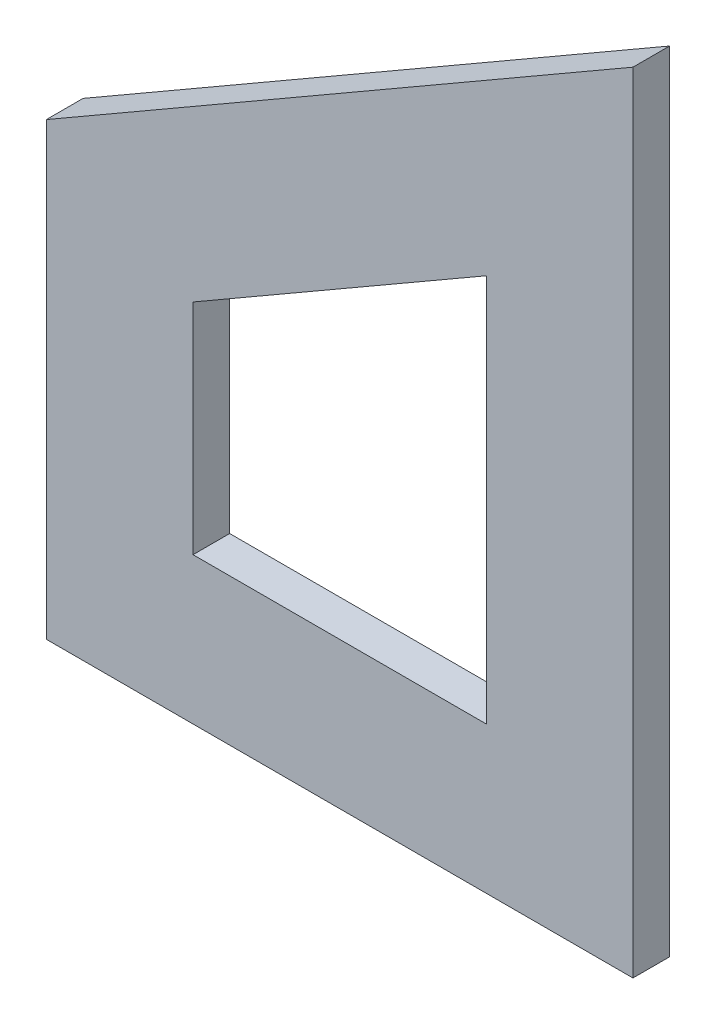
ISO-10303-21;
HEADER;
FILE_DESCRIPTION(('STEP AP214'),'2;1');
FILE_NAME('part.step','',(''),(''),'','','');
FILE_SCHEMA(('AUTOMOTIVE_DESIGN { 1 0 10303 214 1 1 1 1 }'));
ENDSEC;
DATA;
#1=APPLICATION_CONTEXT('core data for automotive mechanical design processes');
#2=APPLICATION_PROTOCOL_DEFINITION('international standard','automotive_design',2000,#1);
#3=PRODUCT_CONTEXT('',#1,'mechanical');
#4=PRODUCT('Part','Part','',(#3));
#5=PRODUCT_RELATED_PRODUCT_CATEGORY('part','',(#4));
#6=PRODUCT_DEFINITION_FORMATION('','',#4);
#7=PRODUCT_DEFINITION_CONTEXT('part definition',#1,'design');
#8=PRODUCT_DEFINITION('design','',#6,#7);
#9=PRODUCT_DEFINITION_SHAPE('','',#8);
#10=(LENGTH_UNIT() NAMED_UNIT(*) SI_UNIT(.MILLI.,.METRE.));
#11=(NAMED_UNIT(*) PLANE_ANGLE_UNIT() SI_UNIT($,.RADIAN.));
#12=(NAMED_UNIT(*) SI_UNIT($,.STERADIAN.) SOLID_ANGLE_UNIT());
#13=UNCERTAINTY_MEASURE_WITH_UNIT(LENGTH_MEASURE(1.E-05),#10,'distance_accuracy_value','');
#14=(GEOMETRIC_REPRESENTATION_CONTEXT(3) GLOBAL_UNCERTAINTY_ASSIGNED_CONTEXT((#13)) GLOBAL_UNIT_ASSIGNED_CONTEXT((#10,
#11,#12)) REPRESENTATION_CONTEXT('',''));
#15=CARTESIAN_POINT('',(0.,0.,0.));
#16=DIRECTION('',(0.,0.,1.));
#17=DIRECTION('',(1.,0.,0.));
#18=AXIS2_PLACEMENT_3D('',#15,#16,#17);
#19=CARTESIAN_POINT('',(-130.83852247825,173.222766944849,3.175));
#20=DIRECTION('',(1.,0.,0.));
#21=DIRECTION('',(0.,1.,0.));
#22=AXIS2_PLACEMENT_3D('',#19,#20,#21);
#23=PLANE('',#22);
#24=DIRECTION('',(0.,-1.,0.));
#25=VECTOR('',#24,1.);
#26=CARTESIAN_POINT('',(-130.83852247825,173.222766944849,-3.175));
#27=LINE('',#26,#25);
#28=CARTESIAN_POINT('',(-130.83852247825,173.222766944849,-3.175));
#29=VERTEX_POINT('',#28);
#30=CARTESIAN_POINT('',(-130.83852247825,95.2499999999999,-3.175));
#31=VERTEX_POINT('',#30);
#32=EDGE_CURVE('E130',#29,#31,#27,.T.);
#33=ORIENTED_EDGE('',*,*,#32,.T.);
#34=DIRECTION('',(0.,0.,-1.));
#35=VECTOR('',#34,1.);
#36=CARTESIAN_POINT('',(-130.83852247825,95.2499999999999,3.175));
#37=LINE('',#36,#35);
#38=CARTESIAN_POINT('',(-130.83852247825,95.2499999999999,3.175));
#39=VERTEX_POINT('',#38);
#40=EDGE_CURVE('E11',#39,#31,#37,.T.);
#41=ORIENTED_EDGE('',*,*,#40,.F.);
#42=DIRECTION('',(0.,-1.,0.));
#43=VECTOR('',#42,1.);
#44=CARTESIAN_POINT('',(-130.83852247825,173.222766944849,3.175));
#45=LINE('',#44,#43);
#46=CARTESIAN_POINT('',(-130.83852247825,173.222766944849,3.175));
#47=VERTEX_POINT('',#46);
#48=EDGE_CURVE('E134',#47,#39,#45,.T.);
#49=ORIENTED_EDGE('',*,*,#48,.F.);
#50=DIRECTION('',(0.,0.,-1.));
#51=VECTOR('',#50,1.);
#52=CARTESIAN_POINT('',(-130.83852247825,173.222766944849,3.175));
#53=LINE('',#52,#51);
#54=EDGE_CURVE('E144',#47,#29,#53,.T.);
#55=ORIENTED_EDGE('',*,*,#54,.T.);
#56=EDGE_LOOP('',(#33,#41,#49,#55));
#57=FACE_BOUND('',#56,.T.);
#58=ADVANCED_FACE('F33',(#57),#23,.F.);
#59=CARTESIAN_POINT('',(-130.83852247825,95.2499999999999,3.175));
#60=DIRECTION('',(0.,1.,0.));
#61=DIRECTION('',(-1.,0.,0.));
#62=AXIS2_PLACEMENT_3D('',#59,#60,#61);
#63=PLANE('',#62);
#64=DIRECTION('',(1.,0.,0.));
#65=VECTOR('',#64,1.);
#66=CARTESIAN_POINT('',(-130.83852247825,95.2499999999999,-3.175));
#67=LINE('',#66,#65);
#68=CARTESIAN_POINT('',(-29.2385224782502,95.2499999999999,-3.175));
#69=VERTEX_POINT('',#68);
#70=EDGE_CURVE('E147',#31,#69,#67,.T.);
#71=ORIENTED_EDGE('',*,*,#70,.T.);
#72=DIRECTION('',(0.,0.,-1.));
#73=VECTOR('',#72,1.);
#74=CARTESIAN_POINT('',(-29.2385224782502,95.2499999999999,3.175));
#75=LINE('',#74,#73);
#76=CARTESIAN_POINT('',(-29.2385224782502,95.2499999999999,3.175));
#77=VERTEX_POINT('',#76);
#78=EDGE_CURVE('E40',#77,#69,#75,.T.);
#79=ORIENTED_EDGE('',*,*,#78,.F.);
#80=DIRECTION('',(1.,0.,0.));
#81=VECTOR('',#80,1.);
#82=CARTESIAN_POINT('',(-130.83852247825,95.2499999999999,3.175));
#83=LINE('',#82,#81);
#84=EDGE_CURVE('E137',#39,#77,#83,.T.);
#85=ORIENTED_EDGE('',*,*,#84,.F.);
#86=ORIENTED_EDGE('',*,*,#40,.T.);
#87=EDGE_LOOP('',(#71,#79,#85,#86));
#88=FACE_BOUND('',#87,.T.);
#89=ADVANCED_FACE('F175',(#88),#63,.F.);
#90=CARTESIAN_POINT('',(-29.2385224782502,95.2499999999999,3.175));
#91=DIRECTION('',(-1.,0.,0.));
#92=DIRECTION('',(0.,0.,1.));
#93=AXIS2_PLACEMENT_3D('',#90,#91,#92);
#94=PLANE('',#93);
#95=DIRECTION('',(0.,1.,0.));
#96=VECTOR('',#95,1.);
#97=CARTESIAN_POINT('',(-29.2385224782502,95.2499999999999,-3.175));
#98=LINE('',#97,#96);
#99=CARTESIAN_POINT('',(-29.2385224782502,231.881554294514,-3.175));
#100=VERTEX_POINT('',#99);
#101=EDGE_CURVE('E149',#69,#100,#98,.T.);
#102=ORIENTED_EDGE('',*,*,#101,.T.);
#103=DIRECTION('',(0.,0.,-1.));
#104=VECTOR('',#103,1.);
#105=CARTESIAN_POINT('',(-29.2385224782502,231.881554294514,3.175));
#106=LINE('',#105,#104);
#107=CARTESIAN_POINT('',(-29.2385224782502,231.881554294514,3.175));
#108=VERTEX_POINT('',#107);
#109=EDGE_CURVE('E154',#108,#100,#106,.T.);
#110=ORIENTED_EDGE('',*,*,#109,.F.);
#111=DIRECTION('',(0.,1.,0.));
#112=VECTOR('',#111,1.);
#113=CARTESIAN_POINT('',(-29.2385224782502,95.2499999999999,3.175));
#114=LINE('',#113,#112);
#115=EDGE_CURVE('E140',#77,#108,#114,.T.);
#116=ORIENTED_EDGE('',*,*,#115,.F.);
#117=ORIENTED_EDGE('',*,*,#78,.T.);
#118=EDGE_LOOP('',(#102,#110,#116,#117));
#119=FACE_BOUND('',#118,.T.);
#120=ADVANCED_FACE('F161',(#119),#94,.F.);
#121=CARTESIAN_POINT('',(-29.2385224782502,231.881554294514,3.175));
#122=DIRECTION('',(0.499999999999995,-0.866025403784442,0.));
#123=DIRECTION('',(0.866025403784442,0.499999999999995,0.));
#124=AXIS2_PLACEMENT_3D('',#121,#122,#123);
#125=PLANE('',#124);
#126=DIRECTION('',(-0.866025403784442,-0.499999999999995,0.));
#127=VECTOR('',#126,1.);
#128=CARTESIAN_POINT('',(-29.2385224782502,231.881554294514,-3.175));
#129=LINE('',#128,#127);
#130=EDGE_CURVE('E138',#100,#29,#129,.T.);
#131=ORIENTED_EDGE('',*,*,#130,.T.);
#132=ORIENTED_EDGE('',*,*,#54,.F.);
#133=DIRECTION('',(-0.866025403784442,-0.499999999999995,0.));
#134=VECTOR('',#133,1.);
#135=CARTESIAN_POINT('',(-29.2385224782502,231.881554294514,3.175));
#136=LINE('',#135,#134);
#137=EDGE_CURVE('E142',#108,#47,#136,.T.);
#138=ORIENTED_EDGE('',*,*,#137,.F.);
#139=ORIENTED_EDGE('',*,*,#109,.T.);
#140=EDGE_LOOP('',(#131,#132,#138,#139));
#141=FACE_BOUND('',#140,.T.);
#142=ADVANCED_FACE('F168',(#141),#125,.F.);
#143=CARTESIAN_POINT('',(0.,0.,3.175));
#144=DIRECTION('',(0.,0.,1.));
#145=DIRECTION('',(1.,0.,0.));
#146=AXIS2_PLACEMENT_3D('',#143,#144,#145);
#147=PLANE('',#146);
#148=DIRECTION('',(1.,0.,0.));
#149=VECTOR('',#148,1.);
#150=CARTESIAN_POINT('',(-105.43852247825,120.65,3.175));
#151=LINE('',#150,#149);
#152=CARTESIAN_POINT('',(-105.43852247825,120.65,3.175));
#153=VERTEX_POINT('',#152);
#154=CARTESIAN_POINT('',(-54.6385224782502,120.65,3.175));
#155=VERTEX_POINT('',#154);
#156=EDGE_CURVE('E47',#153,#155,#151,.T.);
#157=ORIENTED_EDGE('',*,*,#156,.F.);
#158=DIRECTION('',(0.,-1.,0.));
#159=VECTOR('',#158,1.);
#160=CARTESIAN_POINT('',(-105.43852247825,158.558070107432,3.175));
#161=LINE('',#160,#159);
#162=CARTESIAN_POINT('',(-105.43852247825,158.558070107432,3.175));
#163=VERTEX_POINT('',#162);
#164=EDGE_CURVE('E115',#163,#153,#161,.T.);
#165=ORIENTED_EDGE('',*,*,#164,.F.);
#166=DIRECTION('',(-0.866025403784441,-0.499999999999995,0.));
#167=VECTOR('',#166,1.);
#168=CARTESIAN_POINT('',(-54.6385224782502,187.887463782265,3.175));
#169=LINE('',#168,#167);
#170=CARTESIAN_POINT('',(-54.6385224782502,187.887463782265,3.175));
#171=VERTEX_POINT('',#170);
#172=EDGE_CURVE('E118',#171,#163,#169,.T.);
#173=ORIENTED_EDGE('',*,*,#172,.F.);
#174=DIRECTION('',(0.,1.,0.));
#175=VECTOR('',#174,1.);
#176=CARTESIAN_POINT('',(-54.6385224782502,120.65,3.175));
#177=LINE('',#176,#175);
#178=EDGE_CURVE('E124',#155,#171,#177,.T.);
#179=ORIENTED_EDGE('',*,*,#178,.F.);
#180=EDGE_LOOP('',(#157,#165,#173,#179));
#181=FACE_BOUND('',#180,.T.);
#182=ORIENTED_EDGE('',*,*,#48,.T.);
#183=ORIENTED_EDGE('',*,*,#84,.T.);
#184=ORIENTED_EDGE('',*,*,#115,.T.);
#185=ORIENTED_EDGE('',*,*,#137,.T.);
#186=EDGE_LOOP('',(#182,#183,#184,#185));
#187=FACE_BOUND('',#186,.T.);
#188=ADVANCED_FACE('F174',(#181,#187),#147,.T.);
#189=CARTESIAN_POINT('',(0.,0.,-3.175));
#190=DIRECTION('',(0.,0.,1.));
#191=DIRECTION('',(1.,0.,0.));
#192=AXIS2_PLACEMENT_3D('',#189,#190,#191);
#193=PLANE('',#192);
#194=DIRECTION('',(0.,-1.,0.));
#195=VECTOR('',#194,1.);
#196=CARTESIAN_POINT('',(-105.43852247825,158.558070107432,-3.175));
#197=LINE('',#196,#195);
#198=CARTESIAN_POINT('',(-105.43852247825,158.558070107432,-3.175));
#199=VERTEX_POINT('',#198);
#200=CARTESIAN_POINT('',(-105.43852247825,120.65,-3.175));
#201=VERTEX_POINT('',#200);
#202=EDGE_CURVE('E105',#199,#201,#197,.T.);
#203=ORIENTED_EDGE('',*,*,#202,.T.);
#204=DIRECTION('',(1.,0.,0.));
#205=VECTOR('',#204,1.);
#206=CARTESIAN_POINT('',(-105.43852247825,120.65,-3.175));
#207=LINE('',#206,#205);
#208=CARTESIAN_POINT('',(-54.6385224782502,120.65,-3.175));
#209=VERTEX_POINT('',#208);
#210=EDGE_CURVE('E99',#201,#209,#207,.T.);
#211=ORIENTED_EDGE('',*,*,#210,.T.);
#212=DIRECTION('',(0.,1.,0.));
#213=VECTOR('',#212,1.);
#214=CARTESIAN_POINT('',(-54.6385224782502,120.65,-3.175));
#215=LINE('',#214,#213);
#216=CARTESIAN_POINT('',(-54.6385224782502,187.887463782265,-3.175));
#217=VERTEX_POINT('',#216);
#218=EDGE_CURVE('E108',#209,#217,#215,.T.);
#219=ORIENTED_EDGE('',*,*,#218,.T.);
#220=DIRECTION('',(-0.866025403784441,-0.499999999999995,0.));
#221=VECTOR('',#220,1.);
#222=CARTESIAN_POINT('',(-54.6385224782502,187.887463782265,-3.175));
#223=LINE('',#222,#221);
#224=EDGE_CURVE('E55',#217,#199,#223,.T.);
#225=ORIENTED_EDGE('',*,*,#224,.T.);
#226=EDGE_LOOP('',(#203,#211,#219,#225));
#227=FACE_BOUND('',#226,.T.);
#228=ORIENTED_EDGE('',*,*,#32,.F.);
#229=ORIENTED_EDGE('',*,*,#130,.F.);
#230=ORIENTED_EDGE('',*,*,#101,.F.);
#231=ORIENTED_EDGE('',*,*,#70,.F.);
#232=EDGE_LOOP('',(#228,#229,#230,#231));
#233=FACE_BOUND('',#232,.T.);
#234=ADVANCED_FACE('F112',(#227,#233),#193,.F.);
#235=CARTESIAN_POINT('',(-105.43852247825,120.65,-3.175));
#236=DIRECTION('',(0.,-1.,0.));
#237=DIRECTION('',(1.,0.,0.));
#238=AXIS2_PLACEMENT_3D('',#235,#236,#237);
#239=PLANE('',#238);
#240=ORIENTED_EDGE('',*,*,#156,.T.);
#241=DIRECTION('',(0.,0.,1.));
#242=VECTOR('',#241,1.);
#243=CARTESIAN_POINT('',(-54.6385224782502,120.65,-3.175));
#244=LINE('',#243,#242);
#245=EDGE_CURVE('E95',#209,#155,#244,.T.);
#246=ORIENTED_EDGE('',*,*,#245,.F.);
#247=ORIENTED_EDGE('',*,*,#210,.F.);
#248=DIRECTION('',(0.,0.,1.));
#249=VECTOR('',#248,1.);
#250=CARTESIAN_POINT('',(-105.43852247825,120.65,-3.175));
#251=LINE('',#250,#249);
#252=EDGE_CURVE('E128',#201,#153,#251,.T.);
#253=ORIENTED_EDGE('',*,*,#252,.T.);
#254=EDGE_LOOP('',(#240,#246,#247,#253));
#255=FACE_BOUND('',#254,.T.);
#256=ADVANCED_FACE('F97',(#255),#239,.F.);
#257=CARTESIAN_POINT('',(-105.43852247825,158.558070107432,-3.175));
#258=DIRECTION('',(-1.,0.,0.));
#259=DIRECTION('',(0.,-1.,0.));
#260=AXIS2_PLACEMENT_3D('',#257,#258,#259);
#261=PLANE('',#260);
#262=ORIENTED_EDGE('',*,*,#164,.T.);
#263=ORIENTED_EDGE('',*,*,#252,.F.);
#264=ORIENTED_EDGE('',*,*,#202,.F.);
#265=DIRECTION('',(0.,0.,1.));
#266=VECTOR('',#265,1.);
#267=CARTESIAN_POINT('',(-105.43852247825,158.558070107432,-3.175));
#268=LINE('',#267,#266);
#269=EDGE_CURVE('E131',#199,#163,#268,.T.);
#270=ORIENTED_EDGE('',*,*,#269,.T.);
#271=EDGE_LOOP('',(#262,#263,#264,#270));
#272=FACE_BOUND('',#271,.T.);
#273=ADVANCED_FACE('F192',(#272),#261,.F.);
#274=CARTESIAN_POINT('',(-54.6385224782502,187.887463782265,-3.175));
#275=DIRECTION('',(-0.499999999999995,0.866025403784441,0.));
#276=DIRECTION('',(-0.866025403784441,-0.499999999999995,0.));
#277=AXIS2_PLACEMENT_3D('',#274,#275,#276);
#278=PLANE('',#277);
#279=ORIENTED_EDGE('',*,*,#172,.T.);
#280=ORIENTED_EDGE('',*,*,#269,.F.);
#281=ORIENTED_EDGE('',*,*,#224,.F.);
#282=DIRECTION('',(0.,0.,1.));
#283=VECTOR('',#282,1.);
#284=CARTESIAN_POINT('',(-54.6385224782502,187.887463782265,-3.175));
#285=LINE('',#284,#283);
#286=EDGE_CURVE('E104',#217,#171,#285,.T.);
#287=ORIENTED_EDGE('',*,*,#286,.T.);
#288=EDGE_LOOP('',(#279,#280,#281,#287));
#289=FACE_BOUND('',#288,.T.);
#290=ADVANCED_FACE('F195',(#289),#278,.F.);
#291=CARTESIAN_POINT('',(-54.6385224782502,120.65,-3.175));
#292=DIRECTION('',(1.,0.,0.));
#293=DIRECTION('',(0.,0.,-1.));
#294=AXIS2_PLACEMENT_3D('',#291,#292,#293);
#295=PLANE('',#294);
#296=ORIENTED_EDGE('',*,*,#178,.T.);
#297=ORIENTED_EDGE('',*,*,#286,.F.);
#298=ORIENTED_EDGE('',*,*,#218,.F.);
#299=ORIENTED_EDGE('',*,*,#245,.T.);
#300=EDGE_LOOP('',(#296,#297,#298,#299));
#301=FACE_BOUND('',#300,.T.);
#302=ADVANCED_FACE('F109',(#301),#295,.F.);
#303=CLOSED_SHELL('',(#58,#89,#120,#142,#188,#234,#256,#273,#290,#302));
#304=MANIFOLD_SOLID_BREP('B2',#303);
#305=ADVANCED_BREP_SHAPE_REPRESENTATION('',(#18,#304),#14);
#306=SHAPE_DEFINITION_REPRESENTATION(#9,#305);
ENDSEC;
END-ISO-10303-21;
